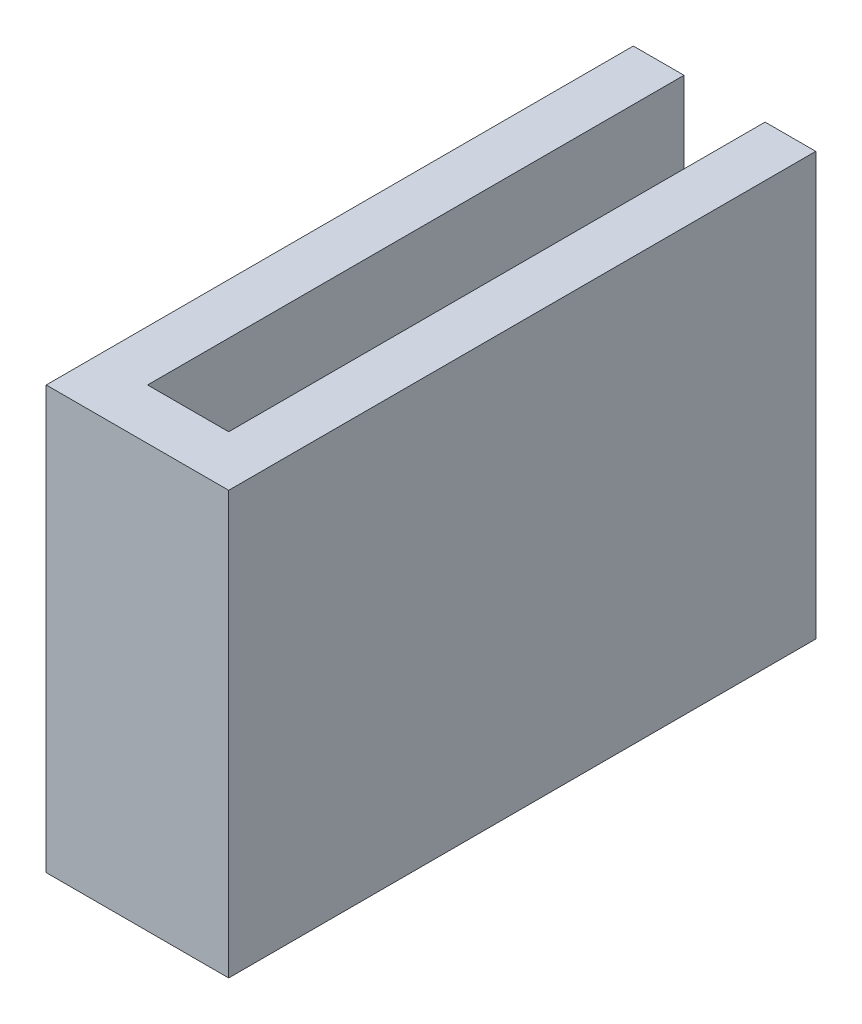
ISO-10303-21;
HEADER;
FILE_DESCRIPTION(('STEP AP214'),'2;1');
FILE_NAME('part.step','',(''),(''),'','','');
FILE_SCHEMA(('AUTOMOTIVE_DESIGN { 1 0 10303 214 1 1 1 1 }'));
ENDSEC;
DATA;
#1=APPLICATION_CONTEXT('core data for automotive mechanical design processes');
#2=APPLICATION_PROTOCOL_DEFINITION('international standard','automotive_design',2000,#1);
#3=PRODUCT_CONTEXT('',#1,'mechanical');
#4=PRODUCT('Part','Part','',(#3));
#5=PRODUCT_RELATED_PRODUCT_CATEGORY('part','',(#4));
#6=PRODUCT_DEFINITION_FORMATION('','',#4);
#7=PRODUCT_DEFINITION_CONTEXT('part definition',#1,'design');
#8=PRODUCT_DEFINITION('design','',#6,#7);
#9=PRODUCT_DEFINITION_SHAPE('','',#8);
#10=(LENGTH_UNIT() NAMED_UNIT(*) SI_UNIT(.MILLI.,.METRE.));
#11=(NAMED_UNIT(*) PLANE_ANGLE_UNIT() SI_UNIT($,.RADIAN.));
#12=(NAMED_UNIT(*) SI_UNIT($,.STERADIAN.) SOLID_ANGLE_UNIT());
#13=UNCERTAINTY_MEASURE_WITH_UNIT(LENGTH_MEASURE(1.E-05),#10,'distance_accuracy_value','');
#14=(GEOMETRIC_REPRESENTATION_CONTEXT(3) GLOBAL_UNCERTAINTY_ASSIGNED_CONTEXT((#13)) GLOBAL_UNIT_ASSIGNED_CONTEXT((#10,
#11,#12)) REPRESENTATION_CONTEXT('',''));
#15=CARTESIAN_POINT('',(0.,0.,0.));
#16=DIRECTION('',(0.,0.,1.));
#17=DIRECTION('',(1.,0.,0.));
#18=AXIS2_PLACEMENT_3D('',#15,#16,#17);
#19=CARTESIAN_POINT('',(10.8,25.,0.));
#20=DIRECTION('',(0.,0.,-1.));
#21=DIRECTION('',(-1.,0.,0.));
#22=AXIS2_PLACEMENT_3D('',#19,#20,#21);
#23=PLANE('',#22);
#24=DIRECTION('',(1.,0.,0.));
#25=VECTOR('',#24,1.);
#26=CARTESIAN_POINT('',(10.8,0.,0.));
#27=LINE('',#26,#25);
#28=CARTESIAN_POINT('',(0.,0.,0.));
#29=VERTEX_POINT('',#28);
#30=CARTESIAN_POINT('',(10.8,0.,0.));
#31=VERTEX_POINT('',#30);
#32=EDGE_CURVE('E140',#29,#31,#27,.T.);
#33=ORIENTED_EDGE('',*,*,#32,.T.);
#34=DIRECTION('',(0.,-1.,0.));
#35=VECTOR('',#34,1.);
#36=CARTESIAN_POINT('',(10.8,25.,0.));
#37=LINE('',#36,#35);
#38=CARTESIAN_POINT('',(10.8,25.,0.));
#39=VERTEX_POINT('',#38);
#40=EDGE_CURVE('E11',#39,#31,#37,.T.);
#41=ORIENTED_EDGE('',*,*,#40,.F.);
#42=DIRECTION('',(1.,0.,0.));
#43=VECTOR('',#42,1.);
#44=CARTESIAN_POINT('',(10.8,25.,0.));
#45=LINE('',#44,#43);
#46=CARTESIAN_POINT('',(0.,25.,0.));
#47=VERTEX_POINT('',#46);
#48=EDGE_CURVE('E162',#47,#39,#45,.T.);
#49=ORIENTED_EDGE('',*,*,#48,.F.);
#50=DIRECTION('',(0.,-1.,0.));
#51=VECTOR('',#50,1.);
#52=CARTESIAN_POINT('',(0.,25.,0.));
#53=LINE('',#52,#51);
#54=EDGE_CURVE('E136',#47,#29,#53,.T.);
#55=ORIENTED_EDGE('',*,*,#54,.T.);
#56=EDGE_LOOP('',(#33,#41,#49,#55));
#57=FACE_BOUND('',#56,.T.);
#58=ADVANCED_FACE('F39',(#57),#23,.F.);
#59=CARTESIAN_POINT('',(10.8,25.,-34.75));
#60=DIRECTION('',(-1.,0.,0.));
#61=DIRECTION('',(0.,0.,1.));
#62=AXIS2_PLACEMENT_3D('',#59,#60,#61);
#63=PLANE('',#62);
#64=DIRECTION('',(0.,0.,-1.));
#65=VECTOR('',#64,1.);
#66=CARTESIAN_POINT('',(10.8,0.,-34.75));
#67=LINE('',#66,#65);
#68=CARTESIAN_POINT('',(10.8,0.,-34.75));
#69=VERTEX_POINT('',#68);
#70=EDGE_CURVE('E144',#31,#69,#67,.T.);
#71=ORIENTED_EDGE('',*,*,#70,.T.);
#72=DIRECTION('',(0.,-1.,0.));
#73=VECTOR('',#72,1.);
#74=CARTESIAN_POINT('',(10.8,25.,-34.75));
#75=LINE('',#74,#73);
#76=CARTESIAN_POINT('',(10.8,25.,-34.75));
#77=VERTEX_POINT('',#76);
#78=EDGE_CURVE('E48',#77,#69,#75,.T.);
#79=ORIENTED_EDGE('',*,*,#78,.F.);
#80=DIRECTION('',(0.,0.,-1.));
#81=VECTOR('',#80,1.);
#82=CARTESIAN_POINT('',(10.8,25.,-34.75));
#83=LINE('',#82,#81);
#84=EDGE_CURVE('E99',#39,#77,#83,.T.);
#85=ORIENTED_EDGE('',*,*,#84,.F.);
#86=ORIENTED_EDGE('',*,*,#40,.T.);
#87=EDGE_LOOP('',(#71,#79,#85,#86));
#88=FACE_BOUND('',#87,.T.);
#89=ADVANCED_FACE('F208',(#88),#63,.F.);
#90=CARTESIAN_POINT('',(7.8,25.,-34.75));
#91=DIRECTION('',(0.,0.,1.));
#92=DIRECTION('',(1.,0.,0.));
#93=AXIS2_PLACEMENT_3D('',#90,#91,#92);
#94=PLANE('',#93);
#95=DIRECTION('',(-1.,0.,0.));
#96=VECTOR('',#95,1.);
#97=CARTESIAN_POINT('',(7.8,0.,-34.75));
#98=LINE('',#97,#96);
#99=CARTESIAN_POINT('',(7.8,0.,-34.75));
#100=VERTEX_POINT('',#99);
#101=EDGE_CURVE('E147',#69,#100,#98,.T.);
#102=ORIENTED_EDGE('',*,*,#101,.T.);
#103=DIRECTION('',(0.,-1.,0.));
#104=VECTOR('',#103,1.);
#105=CARTESIAN_POINT('',(7.8,25.,-34.75));
#106=LINE('',#105,#104);
#107=CARTESIAN_POINT('',(7.8,25.,-34.75));
#108=VERTEX_POINT('',#107);
#109=EDGE_CURVE('E173',#108,#100,#106,.T.);
#110=ORIENTED_EDGE('',*,*,#109,.F.);
#111=DIRECTION('',(-1.,0.,0.));
#112=VECTOR('',#111,1.);
#113=CARTESIAN_POINT('',(7.8,25.,-34.75));
#114=LINE('',#113,#112);
#115=EDGE_CURVE('E183',#77,#108,#114,.T.);
#116=ORIENTED_EDGE('',*,*,#115,.F.);
#117=ORIENTED_EDGE('',*,*,#78,.T.);
#118=EDGE_LOOP('',(#102,#110,#116,#117));
#119=FACE_BOUND('',#118,.T.);
#120=ADVANCED_FACE('F181',(#119),#94,.F.);
#121=CARTESIAN_POINT('',(7.8,25.,-3.));
#122=DIRECTION('',(1.,0.,0.));
#123=DIRECTION('',(0.,0.,-1.));
#124=AXIS2_PLACEMENT_3D('',#121,#122,#123);
#125=PLANE('',#124);
#126=DIRECTION('',(0.,0.,1.));
#127=VECTOR('',#126,1.);
#128=CARTESIAN_POINT('',(7.8,0.,-3.));
#129=LINE('',#128,#127);
#130=CARTESIAN_POINT('',(7.8,0.,-3.));
#131=VERTEX_POINT('',#130);
#132=EDGE_CURVE('E150',#100,#131,#129,.T.);
#133=ORIENTED_EDGE('',*,*,#132,.T.);
#134=DIRECTION('',(0.,-1.,0.));
#135=VECTOR('',#134,1.);
#136=CARTESIAN_POINT('',(7.8,25.,-3.));
#137=LINE('',#136,#135);
#138=CARTESIAN_POINT('',(7.8,25.,-3.));
#139=VERTEX_POINT('',#138);
#140=EDGE_CURVE('E169',#139,#131,#137,.T.);
#141=ORIENTED_EDGE('',*,*,#140,.F.);
#142=DIRECTION('',(0.,0.,1.));
#143=VECTOR('',#142,1.);
#144=CARTESIAN_POINT('',(7.8,25.,-3.));
#145=LINE('',#144,#143);
#146=EDGE_CURVE('E196',#108,#139,#145,.T.);
#147=ORIENTED_EDGE('',*,*,#146,.F.);
#148=ORIENTED_EDGE('',*,*,#109,.T.);
#149=EDGE_LOOP('',(#133,#141,#147,#148));
#150=FACE_BOUND('',#149,.T.);
#151=ADVANCED_FACE('F191',(#150),#125,.F.);
#152=CARTESIAN_POINT('',(3.,25.,-3.));
#153=DIRECTION('',(0.,0.,1.));
#154=DIRECTION('',(1.,0.,0.));
#155=AXIS2_PLACEMENT_3D('',#152,#153,#154);
#156=PLANE('',#155);
#157=DIRECTION('',(-1.,0.,0.));
#158=VECTOR('',#157,1.);
#159=CARTESIAN_POINT('',(3.,0.,-3.));
#160=LINE('',#159,#158);
#161=CARTESIAN_POINT('',(3.,0.,-3.));
#162=VERTEX_POINT('',#161);
#163=EDGE_CURVE('E153',#131,#162,#160,.T.);
#164=ORIENTED_EDGE('',*,*,#163,.T.);
#165=DIRECTION('',(0.,-1.,0.));
#166=VECTOR('',#165,1.);
#167=CARTESIAN_POINT('',(3.,25.,-3.));
#168=LINE('',#167,#166);
#169=CARTESIAN_POINT('',(3.,25.,-3.));
#170=VERTEX_POINT('',#169);
#171=EDGE_CURVE('E129',#170,#162,#168,.T.);
#172=ORIENTED_EDGE('',*,*,#171,.F.);
#173=DIRECTION('',(-1.,0.,0.));
#174=VECTOR('',#173,1.);
#175=CARTESIAN_POINT('',(3.,25.,-3.));
#176=LINE('',#175,#174);
#177=EDGE_CURVE('E118',#139,#170,#176,.T.);
#178=ORIENTED_EDGE('',*,*,#177,.F.);
#179=ORIENTED_EDGE('',*,*,#140,.T.);
#180=EDGE_LOOP('',(#164,#172,#178,#179));
#181=FACE_BOUND('',#180,.T.);
#182=ADVANCED_FACE('F194',(#181),#156,.F.);
#183=CARTESIAN_POINT('',(3.,25.,-34.75));
#184=DIRECTION('',(-1.,0.,0.));
#185=DIRECTION('',(0.,0.,1.));
#186=AXIS2_PLACEMENT_3D('',#183,#184,#185);
#187=PLANE('',#186);
#188=DIRECTION('',(0.,0.,-1.));
#189=VECTOR('',#188,1.);
#190=CARTESIAN_POINT('',(3.,0.,-34.75));
#191=LINE('',#190,#189);
#192=CARTESIAN_POINT('',(3.,0.,-34.75));
#193=VERTEX_POINT('',#192);
#194=EDGE_CURVE('E127',#162,#193,#191,.T.);
#195=ORIENTED_EDGE('',*,*,#194,.T.);
#196=DIRECTION('',(0.,-1.,0.));
#197=VECTOR('',#196,1.);
#198=CARTESIAN_POINT('',(3.,25.,-34.75));
#199=LINE('',#198,#197);
#200=CARTESIAN_POINT('',(3.,25.,-34.75));
#201=VERTEX_POINT('',#200);
#202=EDGE_CURVE('E124',#201,#193,#199,.T.);
#203=ORIENTED_EDGE('',*,*,#202,.F.);
#204=DIRECTION('',(0.,0.,-1.));
#205=VECTOR('',#204,1.);
#206=CARTESIAN_POINT('',(3.,25.,-34.75));
#207=LINE('',#206,#205);
#208=EDGE_CURVE('E112',#170,#201,#207,.T.);
#209=ORIENTED_EDGE('',*,*,#208,.F.);
#210=ORIENTED_EDGE('',*,*,#171,.T.);
#211=EDGE_LOOP('',(#195,#203,#209,#210));
#212=FACE_BOUND('',#211,.T.);
#213=ADVANCED_FACE('F125',(#212),#187,.F.);
#214=CARTESIAN_POINT('',(0.,25.,-34.75));
#215=DIRECTION('',(0.,0.,1.));
#216=DIRECTION('',(1.,0.,0.));
#217=AXIS2_PLACEMENT_3D('',#214,#215,#216);
#218=PLANE('',#217);
#219=DIRECTION('',(-1.,0.,0.));
#220=VECTOR('',#219,1.);
#221=CARTESIAN_POINT('',(0.,0.,-34.75));
#222=LINE('',#221,#220);
#223=CARTESIAN_POINT('',(0.,0.,-34.75));
#224=VERTEX_POINT('',#223);
#225=EDGE_CURVE('E85',#193,#224,#222,.T.);
#226=ORIENTED_EDGE('',*,*,#225,.T.);
#227=DIRECTION('',(0.,-1.,0.));
#228=VECTOR('',#227,1.);
#229=CARTESIAN_POINT('',(0.,25.,-34.75));
#230=LINE('',#229,#228);
#231=CARTESIAN_POINT('',(0.,25.,-34.75));
#232=VERTEX_POINT('',#231);
#233=EDGE_CURVE('E130',#232,#224,#230,.T.);
#234=ORIENTED_EDGE('',*,*,#233,.F.);
#235=DIRECTION('',(-1.,0.,0.));
#236=VECTOR('',#235,1.);
#237=CARTESIAN_POINT('',(0.,25.,-34.75));
#238=LINE('',#237,#236);
#239=EDGE_CURVE('E116',#201,#232,#238,.T.);
#240=ORIENTED_EDGE('',*,*,#239,.F.);
#241=ORIENTED_EDGE('',*,*,#202,.T.);
#242=EDGE_LOOP('',(#226,#234,#240,#241));
#243=FACE_BOUND('',#242,.T.);
#244=ADVANCED_FACE('F132',(#243),#218,.F.);
#245=CARTESIAN_POINT('',(0.,25.,0.));
#246=DIRECTION('',(1.,0.,0.));
#247=DIRECTION('',(0.,0.,-1.));
#248=AXIS2_PLACEMENT_3D('',#245,#246,#247);
#249=PLANE('',#248);
#250=DIRECTION('',(0.,0.,1.));
#251=VECTOR('',#250,1.);
#252=CARTESIAN_POINT('',(0.,0.,0.));
#253=LINE('',#252,#251);
#254=EDGE_CURVE('E91',#224,#29,#253,.T.);
#255=ORIENTED_EDGE('',*,*,#254,.T.);
#256=ORIENTED_EDGE('',*,*,#54,.F.);
#257=DIRECTION('',(0.,0.,1.));
#258=VECTOR('',#257,1.);
#259=CARTESIAN_POINT('',(0.,25.,0.));
#260=LINE('',#259,#258);
#261=EDGE_CURVE('E56',#232,#47,#260,.T.);
#262=ORIENTED_EDGE('',*,*,#261,.F.);
#263=ORIENTED_EDGE('',*,*,#233,.T.);
#264=EDGE_LOOP('',(#255,#256,#262,#263));
#265=FACE_BOUND('',#264,.T.);
#266=ADVANCED_FACE('F224',(#265),#249,.F.);
#267=CARTESIAN_POINT('',(0.,25.,0.));
#268=DIRECTION('',(0.,-1.,0.));
#269=DIRECTION('',(0.,0.,-1.));
#270=AXIS2_PLACEMENT_3D('',#267,#268,#269);
#271=PLANE('',#270);
#272=ORIENTED_EDGE('',*,*,#48,.T.);
#273=ORIENTED_EDGE('',*,*,#84,.T.);
#274=ORIENTED_EDGE('',*,*,#115,.T.);
#275=ORIENTED_EDGE('',*,*,#146,.T.);
#276=ORIENTED_EDGE('',*,*,#177,.T.);
#277=ORIENTED_EDGE('',*,*,#208,.T.);
#278=ORIENTED_EDGE('',*,*,#239,.T.);
#279=ORIENTED_EDGE('',*,*,#261,.T.);
#280=EDGE_LOOP('',(#272,#273,#274,#275,#276,#277,#278,#279));
#281=FACE_BOUND('',#280,.T.);
#282=ADVANCED_FACE('F114',(#281),#271,.F.);
#283=CARTESIAN_POINT('',(0.,0.,0.));
#284=DIRECTION('',(0.,-1.,0.));
#285=DIRECTION('',(0.,0.,-1.));
#286=AXIS2_PLACEMENT_3D('',#283,#284,#285);
#287=PLANE('',#286);
#288=ORIENTED_EDGE('',*,*,#32,.F.);
#289=ORIENTED_EDGE('',*,*,#254,.F.);
#290=ORIENTED_EDGE('',*,*,#225,.F.);
#291=ORIENTED_EDGE('',*,*,#194,.F.);
#292=ORIENTED_EDGE('',*,*,#163,.F.);
#293=ORIENTED_EDGE('',*,*,#132,.F.);
#294=ORIENTED_EDGE('',*,*,#101,.F.);
#295=ORIENTED_EDGE('',*,*,#70,.F.);
#296=EDGE_LOOP('',(#288,#289,#290,#291,#292,#293,#294,#295));
#297=FACE_BOUND('',#296,.T.);
#298=ADVANCED_FACE('F187',(#297),#287,.T.);
#299=CLOSED_SHELL('',(#58,#89,#120,#151,#182,#213,#244,#266,#282,#298));
#300=MANIFOLD_SOLID_BREP('B2',#299);
#301=ADVANCED_BREP_SHAPE_REPRESENTATION('',(#18,#300),#14);
#302=SHAPE_DEFINITION_REPRESENTATION(#9,#301);
ENDSEC;
END-ISO-10303-21;
